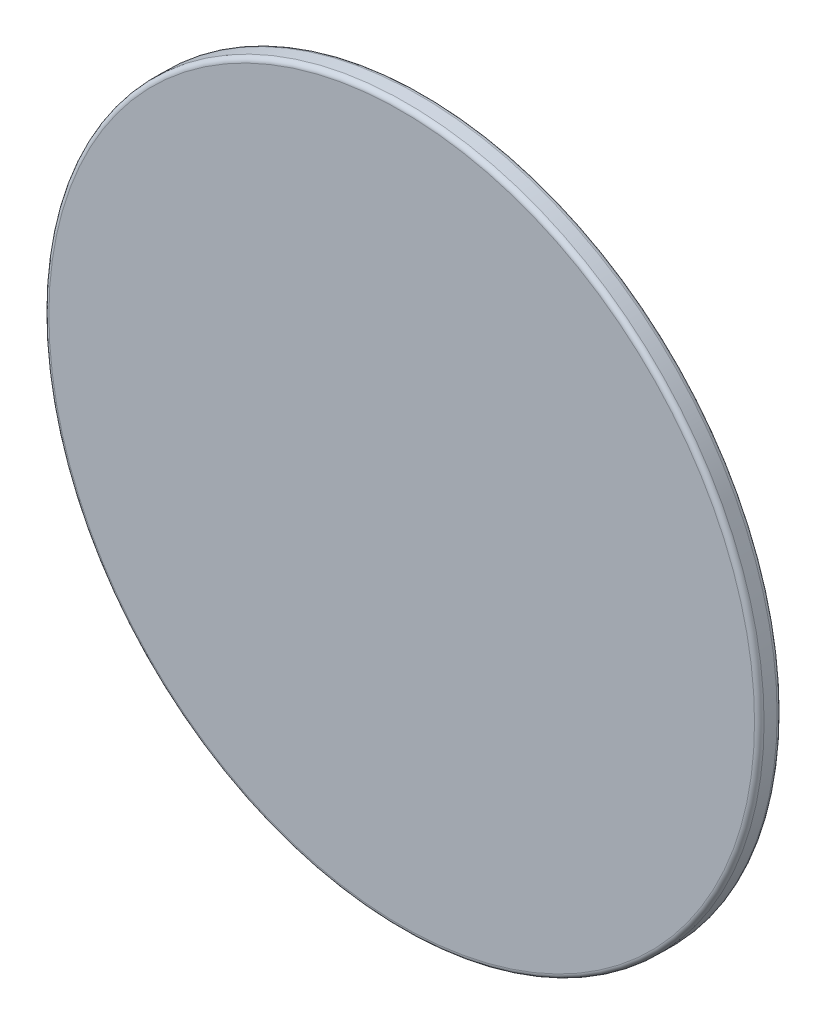
ISO-10303-21;
HEADER;
FILE_DESCRIPTION(('STEP AP214'),'2;1');
FILE_NAME('part.step','',(''),(''),'','','');
FILE_SCHEMA(('AUTOMOTIVE_DESIGN { 1 0 10303 214 1 1 1 1 }'));
ENDSEC;
DATA;
#1=APPLICATION_CONTEXT('core data for automotive mechanical design processes');
#2=APPLICATION_PROTOCOL_DEFINITION('international standard','automotive_design',2000,#1);
#3=PRODUCT_CONTEXT('',#1,'mechanical');
#4=PRODUCT('Part','Part','',(#3));
#5=PRODUCT_RELATED_PRODUCT_CATEGORY('part','',(#4));
#6=PRODUCT_DEFINITION_FORMATION('','',#4);
#7=PRODUCT_DEFINITION_CONTEXT('part definition',#1,'design');
#8=PRODUCT_DEFINITION('design','',#6,#7);
#9=PRODUCT_DEFINITION_SHAPE('','',#8);
#10=(LENGTH_UNIT() NAMED_UNIT(*) SI_UNIT(.MILLI.,.METRE.));
#11=(NAMED_UNIT(*) PLANE_ANGLE_UNIT() SI_UNIT($,.RADIAN.));
#12=(NAMED_UNIT(*) SI_UNIT($,.STERADIAN.) SOLID_ANGLE_UNIT());
#13=UNCERTAINTY_MEASURE_WITH_UNIT(LENGTH_MEASURE(1.E-05),#10,'distance_accuracy_value','');
#14=(GEOMETRIC_REPRESENTATION_CONTEXT(3) GLOBAL_UNCERTAINTY_ASSIGNED_CONTEXT((#13)) GLOBAL_UNIT_ASSIGNED_CONTEXT((#10,
#11,#12)) REPRESENTATION_CONTEXT('',''));
#15=CARTESIAN_POINT('',(0.,0.,0.));
#16=DIRECTION('',(0.,0.,1.));
#17=DIRECTION('',(1.,0.,0.));
#18=AXIS2_PLACEMENT_3D('',#15,#16,#17);
#19=CARTESIAN_POINT('',(0.,0.,1.2));
#20=DIRECTION('',(0.,0.,-1.));
#21=DIRECTION('',(-1.,0.,0.));
#22=AXIS2_PLACEMENT_3D('',#19,#20,#21);
#23=CYLINDRICAL_SURFACE('',#22,19.);
#24=CARTESIAN_POINT('',(0.,0.,0.254));
#25=DIRECTION('',(0.,0.,1.));
#26=DIRECTION('',(1.,0.,0.));
#27=AXIS2_PLACEMENT_3D('',#24,#25,#26);
#28=CIRCLE('',#27,19.);
#29=CARTESIAN_POINT('',(19.,0.,0.254));
#30=VERTEX_POINT('',#29);
#31=EDGE_CURVE('E52',#30,#30,#28,.T.);
#32=ORIENTED_EDGE('',*,*,#31,.T.);
#33=EDGE_LOOP('',(#32));
#34=FACE_BOUND('',#33,.T.);
#35=CARTESIAN_POINT('',(0.,0.,0.946));
#36=DIRECTION('',(0.,0.,1.));
#37=DIRECTION('',(1.,0.,0.));
#38=AXIS2_PLACEMENT_3D('',#35,#36,#37);
#39=CIRCLE('',#38,19.);
#40=CARTESIAN_POINT('',(19.,0.,0.946));
#41=VERTEX_POINT('',#40);
#42=EDGE_CURVE('E56',#41,#41,#39,.F.);
#43=ORIENTED_EDGE('',*,*,#42,.T.);
#44=EDGE_LOOP('',(#43));
#45=FACE_BOUND('',#44,.T.);
#46=ADVANCED_FACE('F41',(#34,#45),#23,.T.);
#47=CARTESIAN_POINT('',(0.,0.,1.2));
#48=DIRECTION('',(0.,0.,1.));
#49=DIRECTION('',(1.,0.,0.));
#50=AXIS2_PLACEMENT_3D('',#47,#48,#49);
#51=PLANE('',#50);
#52=CARTESIAN_POINT('',(0.,0.,1.2));
#53=DIRECTION('',(0.,0.,1.));
#54=DIRECTION('',(1.,0.,0.));
#55=AXIS2_PLACEMENT_3D('',#52,#53,#54);
#56=CIRCLE('',#55,18.746);
#57=CARTESIAN_POINT('',(18.746,0.,1.2));
#58=VERTEX_POINT('',#57);
#59=EDGE_CURVE('E10',#58,#58,#56,.T.);
#60=ORIENTED_EDGE('',*,*,#59,.T.);
#61=EDGE_LOOP('',(#60));
#62=FACE_BOUND('',#61,.T.);
#63=ADVANCED_FACE('F72',(#62),#51,.T.);
#64=CARTESIAN_POINT('',(0.,0.,0.));
#65=DIRECTION('',(0.,0.,1.));
#66=DIRECTION('',(1.,0.,0.));
#67=AXIS2_PLACEMENT_3D('',#64,#65,#66);
#68=PLANE('',#67);
#69=CARTESIAN_POINT('',(0.,0.,0.));
#70=DIRECTION('',(0.,0.,1.));
#71=DIRECTION('',(1.,0.,0.));
#72=AXIS2_PLACEMENT_3D('',#69,#70,#71);
#73=CIRCLE('',#72,18.746);
#74=CARTESIAN_POINT('',(18.746,0.,0.));
#75=VERTEX_POINT('',#74);
#76=EDGE_CURVE('E48',#75,#75,#73,.F.);
#77=ORIENTED_EDGE('',*,*,#76,.T.);
#78=EDGE_LOOP('',(#77));
#79=FACE_BOUND('',#78,.T.);
#80=ADVANCED_FACE('F69',(#79),#68,.F.);
#81=CARTESIAN_POINT('',(0.,0.,0.254));
#82=DIRECTION('',(0.,0.,1.));
#83=DIRECTION('',(1.,0.,0.));
#84=AXIS2_PLACEMENT_3D('',#81,#82,#83);
#85=TOROIDAL_SURFACE('',#84,18.746,0.254);
#86=ORIENTED_EDGE('',*,*,#76,.F.);
#87=EDGE_LOOP('',(#86));
#88=FACE_BOUND('',#87,.T.);
#89=ORIENTED_EDGE('',*,*,#31,.F.);
#90=EDGE_LOOP('',(#89));
#91=FACE_BOUND('',#90,.T.);
#92=ADVANCED_FACE('F65',(#88,#91),#85,.T.);
#93=CARTESIAN_POINT('',(0.,0.,0.946));
#94=DIRECTION('',(0.,0.,1.));
#95=DIRECTION('',(1.,0.,0.));
#96=AXIS2_PLACEMENT_3D('',#93,#94,#95);
#97=TOROIDAL_SURFACE('',#96,18.746,0.254);
#98=ORIENTED_EDGE('',*,*,#42,.F.);
#99=EDGE_LOOP('',(#98));
#100=FACE_BOUND('',#99,.T.);
#101=ORIENTED_EDGE('',*,*,#59,.F.);
#102=EDGE_LOOP('',(#101));
#103=FACE_BOUND('',#102,.T.);
#104=ADVANCED_FACE('F43',(#100,#103),#97,.T.);
#105=CLOSED_SHELL('',(#46,#63,#80,#92,#104));
#106=MANIFOLD_SOLID_BREP('B2',#105);
#107=ADVANCED_BREP_SHAPE_REPRESENTATION('',(#18,#106),#14);
#108=SHAPE_DEFINITION_REPRESENTATION(#9,#107);
ENDSEC;
END-ISO-10303-21;
